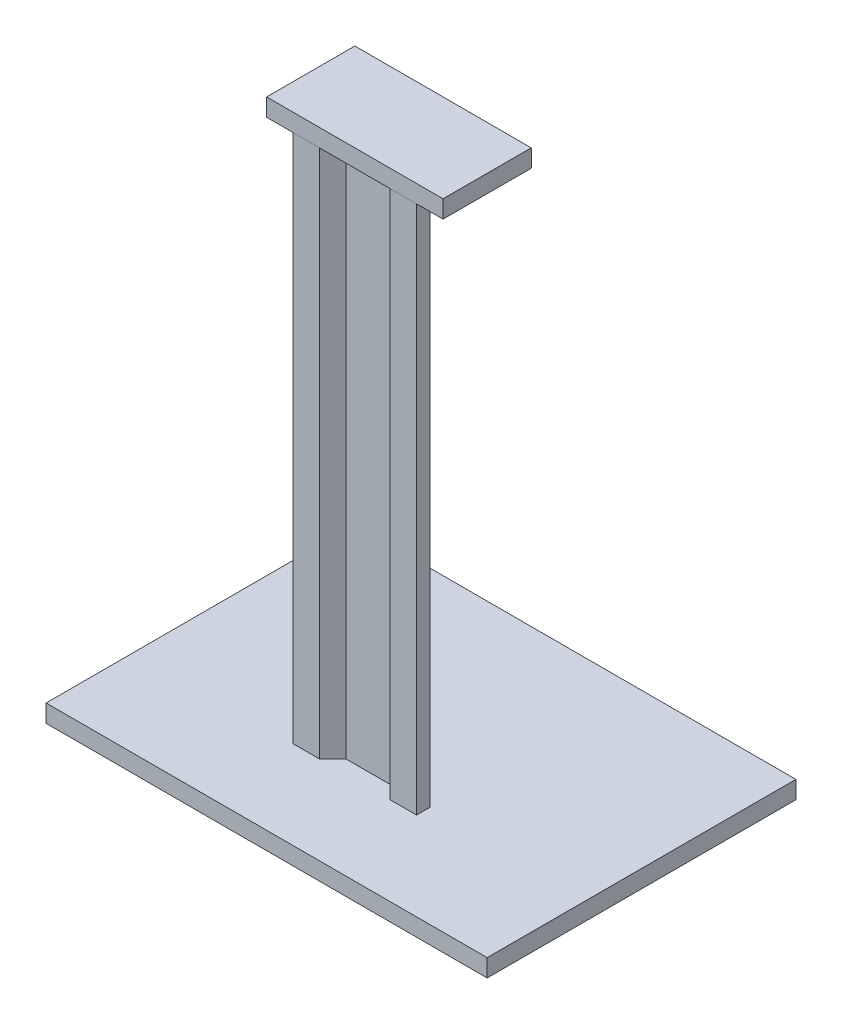
ISO-10303-21;
HEADER;
FILE_DESCRIPTION(('STEP AP214'),'2;1');
FILE_NAME('part.step','',(''),(''),'','','');
FILE_SCHEMA(('AUTOMOTIVE_DESIGN { 1 0 10303 214 1 1 1 1 }'));
ENDSEC;
DATA;
#1=APPLICATION_CONTEXT('core data for automotive mechanical design processes');
#2=APPLICATION_PROTOCOL_DEFINITION('international standard','automotive_design',2000,#1);
#3=PRODUCT_CONTEXT('',#1,'mechanical');
#4=PRODUCT('Part','Part','',(#3));
#5=PRODUCT_RELATED_PRODUCT_CATEGORY('part','',(#4));
#6=PRODUCT_DEFINITION_FORMATION('','',#4);
#7=PRODUCT_DEFINITION_CONTEXT('part definition',#1,'design');
#8=PRODUCT_DEFINITION('design','',#6,#7);
#9=PRODUCT_DEFINITION_SHAPE('','',#8);
#10=(LENGTH_UNIT() NAMED_UNIT(*) SI_UNIT(.MILLI.,.METRE.));
#11=(NAMED_UNIT(*) PLANE_ANGLE_UNIT() SI_UNIT($,.RADIAN.));
#12=(NAMED_UNIT(*) SI_UNIT($,.STERADIAN.) SOLID_ANGLE_UNIT());
#13=UNCERTAINTY_MEASURE_WITH_UNIT(LENGTH_MEASURE(1.E-05),#10,'distance_accuracy_value','');
#14=(GEOMETRIC_REPRESENTATION_CONTEXT(3) GLOBAL_UNCERTAINTY_ASSIGNED_CONTEXT((#13)) GLOBAL_UNIT_ASSIGNED_CONTEXT((#10,
#11,#12)) REPRESENTATION_CONTEXT('',''));
#15=CARTESIAN_POINT('',(0.,0.,0.));
#16=DIRECTION('',(0.,0.,1.));
#17=DIRECTION('',(1.,0.,0.));
#18=AXIS2_PLACEMENT_3D('',#15,#16,#17);
#19=CARTESIAN_POINT('',(-100.,620.,0.));
#20=DIRECTION('',(1.,0.,0.));
#21=DIRECTION('',(0.,0.,-1.));
#22=AXIS2_PLACEMENT_3D('',#19,#20,#21);
#23=PLANE('',#22);
#24=DIRECTION('',(0.,0.,1.));
#25=VECTOR('',#24,1.);
#26=CARTESIAN_POINT('',(-100.,600.,0.));
#27=LINE('',#26,#25);
#28=CARTESIAN_POINT('',(-100.,600.,-100.));
#29=VERTEX_POINT('',#28);
#30=CARTESIAN_POINT('',(-100.,600.,0.));
#31=VERTEX_POINT('',#30);
#32=EDGE_CURVE('E109',#29,#31,#27,.T.);
#33=ORIENTED_EDGE('',*,*,#32,.T.);
#34=DIRECTION('',(0.,-1.,0.));
#35=VECTOR('',#34,1.);
#36=CARTESIAN_POINT('',(-100.,620.,0.));
#37=LINE('',#36,#35);
#38=CARTESIAN_POINT('',(-100.,620.,0.));
#39=VERTEX_POINT('',#38);
#40=EDGE_CURVE('E12',#39,#31,#37,.T.);
#41=ORIENTED_EDGE('',*,*,#40,.F.);
#42=DIRECTION('',(0.,0.,1.));
#43=VECTOR('',#42,1.);
#44=CARTESIAN_POINT('',(-100.,620.,0.));
#45=LINE('',#44,#43);
#46=CARTESIAN_POINT('',(-100.,620.,-100.));
#47=VERTEX_POINT('',#46);
#48=EDGE_CURVE('E97',#47,#39,#45,.T.);
#49=ORIENTED_EDGE('',*,*,#48,.F.);
#50=DIRECTION('',(0.,-1.,0.));
#51=VECTOR('',#50,1.);
#52=CARTESIAN_POINT('',(-100.,620.,-100.));
#53=LINE('',#52,#51);
#54=EDGE_CURVE('E105',#47,#29,#53,.T.);
#55=ORIENTED_EDGE('',*,*,#54,.T.);
#56=EDGE_LOOP('',(#33,#41,#49,#55));
#57=FACE_BOUND('',#56,.T.);
#58=ADVANCED_FACE('F46',(#57),#23,.F.);
#59=CARTESIAN_POINT('',(-100.,620.,0.));
#60=DIRECTION('',(0.,0.,-1.));
#61=DIRECTION('',(-1.,0.,0.));
#62=AXIS2_PLACEMENT_3D('',#59,#60,#61);
#63=PLANE('',#62);
#64=DIRECTION('',(1.,0.,0.));
#65=VECTOR('',#64,1.);
#66=CARTESIAN_POINT('',(-100.,600.,0.));
#67=LINE('',#66,#65);
#68=CARTESIAN_POINT('',(100.,600.,0.));
#69=VERTEX_POINT('',#68);
#70=EDGE_CURVE('E101',#31,#69,#67,.T.);
#71=ORIENTED_EDGE('',*,*,#70,.T.);
#72=DIRECTION('',(0.,-1.,0.));
#73=VECTOR('',#72,1.);
#74=CARTESIAN_POINT('',(100.,620.,0.));
#75=LINE('',#74,#73);
#76=CARTESIAN_POINT('',(100.,620.,0.));
#77=VERTEX_POINT('',#76);
#78=EDGE_CURVE('E54',#77,#69,#75,.T.);
#79=ORIENTED_EDGE('',*,*,#78,.F.);
#80=DIRECTION('',(1.,0.,0.));
#81=VECTOR('',#80,1.);
#82=CARTESIAN_POINT('',(-100.,620.,0.));
#83=LINE('',#82,#81);
#84=EDGE_CURVE('E92',#39,#77,#83,.T.);
#85=ORIENTED_EDGE('',*,*,#84,.F.);
#86=ORIENTED_EDGE('',*,*,#40,.T.);
#87=EDGE_LOOP('',(#71,#79,#85,#86));
#88=FACE_BOUND('',#87,.T.);
#89=ADVANCED_FACE('F100',(#88),#63,.F.);
#90=CARTESIAN_POINT('',(100.,620.,0.));
#91=DIRECTION('',(-1.,0.,0.));
#92=DIRECTION('',(0.,0.,1.));
#93=AXIS2_PLACEMENT_3D('',#90,#91,#92);
#94=PLANE('',#93);
#95=DIRECTION('',(0.,0.,-1.));
#96=VECTOR('',#95,1.);
#97=CARTESIAN_POINT('',(100.,600.,0.));
#98=LINE('',#97,#96);
#99=CARTESIAN_POINT('',(100.,600.,-100.));
#100=VERTEX_POINT('',#99);
#101=EDGE_CURVE('E79',#69,#100,#98,.T.);
#102=ORIENTED_EDGE('',*,*,#101,.T.);
#103=DIRECTION('',(0.,-1.,0.));
#104=VECTOR('',#103,1.);
#105=CARTESIAN_POINT('',(100.,620.,-100.));
#106=LINE('',#105,#104);
#107=CARTESIAN_POINT('',(100.,620.,-100.));
#108=VERTEX_POINT('',#107);
#109=EDGE_CURVE('E102',#108,#100,#106,.T.);
#110=ORIENTED_EDGE('',*,*,#109,.F.);
#111=DIRECTION('',(0.,0.,-1.));
#112=VECTOR('',#111,1.);
#113=CARTESIAN_POINT('',(100.,620.,0.));
#114=LINE('',#113,#112);
#115=EDGE_CURVE('E95',#77,#108,#114,.T.);
#116=ORIENTED_EDGE('',*,*,#115,.F.);
#117=ORIENTED_EDGE('',*,*,#78,.T.);
#118=EDGE_LOOP('',(#102,#110,#116,#117));
#119=FACE_BOUND('',#118,.T.);
#120=ADVANCED_FACE('F103',(#119),#94,.F.);
#121=CARTESIAN_POINT('',(-100.,620.,-100.));
#122=DIRECTION('',(0.,0.,1.));
#123=DIRECTION('',(1.,0.,0.));
#124=AXIS2_PLACEMENT_3D('',#121,#122,#123);
#125=PLANE('',#124);
#126=DIRECTION('',(-1.,0.,0.));
#127=VECTOR('',#126,1.);
#128=CARTESIAN_POINT('',(-100.,600.,-100.));
#129=LINE('',#128,#127);
#130=EDGE_CURVE('E85',#100,#29,#129,.T.);
#131=ORIENTED_EDGE('',*,*,#130,.T.);
#132=ORIENTED_EDGE('',*,*,#54,.F.);
#133=DIRECTION('',(-1.,0.,0.));
#134=VECTOR('',#133,1.);
#135=CARTESIAN_POINT('',(-100.,620.,-100.));
#136=LINE('',#135,#134);
#137=EDGE_CURVE('E62',#108,#47,#136,.T.);
#138=ORIENTED_EDGE('',*,*,#137,.F.);
#139=ORIENTED_EDGE('',*,*,#109,.T.);
#140=EDGE_LOOP('',(#131,#132,#138,#139));
#141=FACE_BOUND('',#140,.T.);
#142=ADVANCED_FACE('F116',(#141),#125,.F.);
#143=CARTESIAN_POINT('',(0.,620.,0.));
#144=DIRECTION('',(0.,-1.,0.));
#145=DIRECTION('',(0.,0.,-1.));
#146=AXIS2_PLACEMENT_3D('',#143,#144,#145);
#147=PLANE('',#146);
#148=ORIENTED_EDGE('',*,*,#48,.T.);
#149=ORIENTED_EDGE('',*,*,#84,.T.);
#150=ORIENTED_EDGE('',*,*,#115,.T.);
#151=ORIENTED_EDGE('',*,*,#137,.T.);
#152=EDGE_LOOP('',(#148,#149,#150,#151));
#153=FACE_BOUND('',#152,.T.);
#154=ADVANCED_FACE('F93',(#153),#147,.F.);
#155=CARTESIAN_POINT('',(0.,600.,0.));
#156=DIRECTION('',(0.,-1.,0.));
#157=DIRECTION('',(0.,0.,-1.));
#158=AXIS2_PLACEMENT_3D('',#155,#156,#157);
#159=PLANE('',#158);
#160=ORIENTED_EDGE('',*,*,#32,.F.);
#161=ORIENTED_EDGE('',*,*,#130,.F.);
#162=ORIENTED_EDGE('',*,*,#101,.F.);
#163=ORIENTED_EDGE('',*,*,#70,.F.);
#164=EDGE_LOOP('',(#160,#161,#162,#163));
#165=FACE_BOUND('',#164,.T.);
#166=ADVANCED_FACE('F119',(#165),#159,.T.);
#167=CLOSED_SHELL('',(#58,#89,#120,#142,#154,#166));
#168=MANIFOLD_SOLID_BREP('B2',#167);
#169=CARTESIAN_POINT('',(0.,0.,0.));
#170=DIRECTION('',(0.,1.,0.));
#171=DIRECTION('',(0.,0.,1.));
#172=AXIS2_PLACEMENT_3D('',#169,#170,#171);
#173=PLANE('',#172);
#174=CARTESIAN_POINT('',(0.,0.,-61.2132034355965));
#175=DIRECTION('',(0.,1.,0.));
#176=DIRECTION('',(0.,0.,1.));
#177=AXIS2_PLACEMENT_3D('',#174,#175,#176);
#178=CIRCLE('',#177,15.);
#179=CARTESIAN_POINT('',(0.,0.,-46.2132034355965));
#180=VERTEX_POINT('',#179);
#181=EDGE_CURVE('E194',#180,#180,#178,.F.);
#182=ORIENTED_EDGE('',*,*,#181,.T.);
#183=EDGE_LOOP('',(#182));
#184=FACE_BOUND('',#183,.T.);
#185=ADVANCED_FACE('F190',(#184),#173,.F.);
#186=CARTESIAN_POINT('',(0.,-20.002,-61.2132034355965));
#187=DIRECTION('',(0.,1.,0.));
#188=DIRECTION('',(0.,0.,1.));
#189=AXIS2_PLACEMENT_3D('',#186,#187,#188);
#190=CYLINDRICAL_SURFACE('',#189,15.);
#191=ORIENTED_EDGE('',*,*,#181,.F.);
#192=EDGE_LOOP('',(#191));
#193=FACE_BOUND('',#192,.T.);
#194=CARTESIAN_POINT('',(0.,600.,-61.2132034355965));
#195=DIRECTION('',(0.,1.,0.));
#196=DIRECTION('',(0.,0.,1.));
#197=AXIS2_PLACEMENT_3D('',#194,#195,#196);
#198=CIRCLE('',#197,15.);
#199=CARTESIAN_POINT('',(0.,600.,-46.2132034355965));
#200=VERTEX_POINT('',#199);
#201=EDGE_CURVE('E45',#200,#200,#198,.T.);
#202=ORIENTED_EDGE('',*,*,#201,.F.);
#203=EDGE_LOOP('',(#202));
#204=FACE_BOUND('',#203,.T.);
#205=ADVANCED_FACE('F192',(#193,#204),#190,.T.);
#206=CARTESIAN_POINT('',(0.,600.,-61.2132034355965));
#207=DIRECTION('',(0.,1.,0.));
#208=DIRECTION('',(0.,0.,1.));
#209=AXIS2_PLACEMENT_3D('',#206,#207,#208);
#210=PLANE('',#209);
#211=ORIENTED_EDGE('',*,*,#201,.T.);
#212=EDGE_LOOP('',(#211));
#213=FACE_BOUND('',#212,.T.);
#214=ADVANCED_FACE('F206',(#213),#210,.T.);
#215=CLOSED_SHELL('',(#185,#205,#214));
#216=MANIFOLD_SOLID_BREP('B6',#215);
#217=CARTESIAN_POINT('',(70.,600.,-15.));
#218=DIRECTION('',(0.,0.,1.));
#219=DIRECTION('',(1.,0.,0.));
#220=AXIS2_PLACEMENT_3D('',#217,#218,#219);
#221=PLANE('',#220);
#222=DIRECTION('',(0.,1.,0.));
#223=VECTOR('',#222,1.);
#224=CARTESIAN_POINT('',(59.6066017177983,0.,-15.));
#225=LINE('',#224,#223);
#226=CARTESIAN_POINT('',(59.6066017177983,0.,-15.));
#227=VERTEX_POINT('',#226);
#228=CARTESIAN_POINT('',(59.6066017177982,600.,-15.));
#229=VERTEX_POINT('',#228);
#230=EDGE_CURVE('E251',#227,#229,#225,.T.);
#231=ORIENTED_EDGE('',*,*,#230,.T.);
#232=DIRECTION('',(-1.,0.,0.));
#233=VECTOR('',#232,1.);
#234=CARTESIAN_POINT('',(70.,600.,-15.));
#235=LINE('',#234,#233);
#236=CARTESIAN_POINT('',(70.,600.,-15.));
#237=VERTEX_POINT('',#236);
#238=EDGE_CURVE('E499',#237,#229,#235,.T.);
#239=ORIENTED_EDGE('',*,*,#238,.F.);
#240=DIRECTION('',(0.,-1.,0.));
#241=VECTOR('',#240,1.);
#242=CARTESIAN_POINT('',(70.,600.,-15.));
#243=LINE('',#242,#241);
#244=CARTESIAN_POINT('',(70.,0.,-15.));
#245=VERTEX_POINT('',#244);
#246=EDGE_CURVE('E244',#237,#245,#243,.T.);
#247=ORIENTED_EDGE('',*,*,#246,.T.);
#248=DIRECTION('',(-1.,0.,0.));
#249=VECTOR('',#248,1.);
#250=CARTESIAN_POINT('',(70.,0.,-15.));
#251=LINE('',#250,#249);
#252=EDGE_CURVE('E531',#245,#227,#251,.T.);
#253=ORIENTED_EDGE('',*,*,#252,.T.);
#254=EDGE_LOOP('',(#231,#239,#247,#253));
#255=FACE_BOUND('',#254,.T.);
#256=ADVANCED_FACE('F236',(#255),#221,.F.);
#257=DIRECTION('',(0.,-1.,0.));
#258=VECTOR('',#257,1.);
#259=CARTESIAN_POINT('',(56.6066017177983,0.,-15.));
#260=LINE('',#259,#258);
#261=CARTESIAN_POINT('',(56.6066017177982,600.,-15.));
#262=VERTEX_POINT('',#261);
#263=CARTESIAN_POINT('',(56.6066017177983,0.,-15.));
#264=VERTEX_POINT('',#263);
#265=EDGE_CURVE('E423',#262,#264,#260,.T.);
#266=ORIENTED_EDGE('',*,*,#265,.T.);
#267=CARTESIAN_POINT('',(46.2132034355965,0.,-15.));
#268=VERTEX_POINT('',#267);
#269=EDGE_CURVE('E530',#264,#268,#251,.T.);
#270=ORIENTED_EDGE('',*,*,#269,.T.);
#271=DIRECTION('',(0.,-1.,0.));
#272=VECTOR('',#271,1.);
#273=CARTESIAN_POINT('',(46.2132034355965,600.,-15.));
#274=LINE('',#273,#272);
#275=CARTESIAN_POINT('',(46.2132034355965,600.,-15.));
#276=VERTEX_POINT('',#275);
#277=EDGE_CURVE('E592',#276,#268,#274,.T.);
#278=ORIENTED_EDGE('',*,*,#277,.F.);
#279=EDGE_CURVE('E498',#262,#276,#235,.T.);
#280=ORIENTED_EDGE('',*,*,#279,.F.);
#281=EDGE_LOOP('',(#266,#270,#278,#280));
#282=FACE_BOUND('',#281,.T.);
#283=ADVANCED_FACE('F664',(#282),#221,.F.);
#284=CARTESIAN_POINT('',(0.,600.,0.));
#285=DIRECTION('',(0.,1.,0.));
#286=DIRECTION('',(0.,0.,1.));
#287=AXIS2_PLACEMENT_3D('',#284,#285,#286);
#288=PLANE('',#287);
#289=ORIENTED_EDGE('',*,*,#238,.T.);
#290=DIRECTION('',(0.,0.,-1.));
#291=VECTOR('',#290,1.);
#292=CARTESIAN_POINT('',(59.6066017177982,600.,-13.));
#293=LINE('',#292,#291);
#294=CARTESIAN_POINT('',(59.6066017177982,600.,-13.));
#295=VERTEX_POINT('',#294);
#296=EDGE_CURVE('E431',#295,#229,#293,.T.);
#297=ORIENTED_EDGE('',*,*,#296,.F.);
#298=DIRECTION('',(-1.,0.,0.));
#299=VECTOR('',#298,1.);
#300=CARTESIAN_POINT('',(56.6066017177982,600.,-13.));
#301=LINE('',#300,#299);
#302=CARTESIAN_POINT('',(56.6066017177982,600.,-13.));
#303=VERTEX_POINT('',#302);
#304=EDGE_CURVE('E419',#295,#303,#301,.T.);
#305=ORIENTED_EDGE('',*,*,#304,.T.);
#306=DIRECTION('',(0.,0.,-1.));
#307=VECTOR('',#306,1.);
#308=CARTESIAN_POINT('',(56.6066017177982,600.,-13.));
#309=LINE('',#308,#307);
#310=EDGE_CURVE('E434',#303,#262,#309,.T.);
#311=ORIENTED_EDGE('',*,*,#310,.T.);
#312=ORIENTED_EDGE('',*,*,#279,.T.);
#313=DIRECTION('',(-0.707106781186546,0.,-0.707106781186549));
#314=VECTOR('',#313,1.);
#315=CARTESIAN_POINT('',(46.2132034355965,600.,-15.));
#316=LINE('',#315,#314);
#317=CARTESIAN_POINT('',(10.6066017177983,600.,-50.6066017177984));
#318=VERTEX_POINT('',#317);
#319=EDGE_CURVE('E502',#276,#318,#316,.T.);
#320=ORIENTED_EDGE('',*,*,#319,.T.);
#321=DIRECTION('',(-0.707106781186543,0.,0.707106781186552));
#322=VECTOR('',#321,1.);
#323=CARTESIAN_POINT('',(10.6066017177983,600.,-50.6066017177984));
#324=LINE('',#323,#322);
#325=CARTESIAN_POINT('',(0.,600.,-40.));
#326=VERTEX_POINT('',#325);
#327=EDGE_CURVE('E504',#318,#326,#324,.T.);
#328=ORIENTED_EDGE('',*,*,#327,.T.);
#329=DIRECTION('',(-0.707106781186543,0.,-0.707106781186552));
#330=VECTOR('',#329,1.);
#331=CARTESIAN_POINT('',(-10.6066017177983,600.,-50.6066017177984));
#332=LINE('',#331,#330);
#333=CARTESIAN_POINT('',(-10.6066017177983,600.,-50.6066017177984));
#334=VERTEX_POINT('',#333);
#335=EDGE_CURVE('E506',#326,#334,#332,.T.);
#336=ORIENTED_EDGE('',*,*,#335,.T.);
#337=DIRECTION('',(-0.707106781186546,0.,0.707106781186549));
#338=VECTOR('',#337,1.);
#339=CARTESIAN_POINT('',(-46.2132034355965,600.,-15.));
#340=LINE('',#339,#338);
#341=CARTESIAN_POINT('',(-46.2132034355965,600.,-15.));
#342=VERTEX_POINT('',#341);
#343=EDGE_CURVE('E508',#334,#342,#340,.T.);
#344=ORIENTED_EDGE('',*,*,#343,.T.);
#345=DIRECTION('',(-1.,0.,0.));
#346=VECTOR('',#345,1.);
#347=CARTESIAN_POINT('',(-70.,600.,-15.));
#348=LINE('',#347,#346);
#349=CARTESIAN_POINT('',(-56.6066017177982,600.,-15.));
#350=VERTEX_POINT('',#349);
#351=EDGE_CURVE('E511',#342,#350,#348,.T.);
#352=ORIENTED_EDGE('',*,*,#351,.T.);
#353=DIRECTION('',(0.,0.,-1.));
#354=VECTOR('',#353,1.);
#355=CARTESIAN_POINT('',(-56.6066017177982,600.,-13.));
#356=LINE('',#355,#354);
#357=CARTESIAN_POINT('',(-56.6066017177982,600.,-13.));
#358=VERTEX_POINT('',#357);
#359=EDGE_CURVE('E458',#358,#350,#356,.T.);
#360=ORIENTED_EDGE('',*,*,#359,.F.);
#361=DIRECTION('',(1.,0.,0.));
#362=VECTOR('',#361,1.);
#363=CARTESIAN_POINT('',(-56.6066017177982,600.,-13.));
#364=LINE('',#363,#362);
#365=CARTESIAN_POINT('',(-59.6066017177982,600.,-13.));
#366=VERTEX_POINT('',#365);
#367=EDGE_CURVE('E441',#366,#358,#364,.T.);
#368=ORIENTED_EDGE('',*,*,#367,.F.);
#369=DIRECTION('',(0.,0.,-1.));
#370=VECTOR('',#369,1.);
#371=CARTESIAN_POINT('',(-59.6066017177982,600.,-13.));
#372=LINE('',#371,#370);
#373=CARTESIAN_POINT('',(-59.6066017177982,600.,-15.));
#374=VERTEX_POINT('',#373);
#375=EDGE_CURVE('E450',#366,#374,#372,.T.);
#376=ORIENTED_EDGE('',*,*,#375,.T.);
#377=CARTESIAN_POINT('',(-70.,600.,-15.));
#378=VERTEX_POINT('',#377);
#379=EDGE_CURVE('E510',#374,#378,#348,.T.);
#380=ORIENTED_EDGE('',*,*,#379,.T.);
#381=DIRECTION('',(0.,0.,1.));
#382=VECTOR('',#381,1.);
#383=CARTESIAN_POINT('',(-70.,600.,0.));
#384=LINE('',#383,#382);
#385=CARTESIAN_POINT('',(-70.,600.,0.));
#386=VERTEX_POINT('',#385);
#387=EDGE_CURVE('E514',#378,#386,#384,.T.);
#388=ORIENTED_EDGE('',*,*,#387,.T.);
#389=DIRECTION('',(1.,0.,0.));
#390=VECTOR('',#389,1.);
#391=CARTESIAN_POINT('',(-39.9999999999999,600.,0.));
#392=LINE('',#391,#390);
#393=CARTESIAN_POINT('',(-39.9999999999999,600.,0.));
#394=VERTEX_POINT('',#393);
#395=EDGE_CURVE('E516',#386,#394,#392,.T.);
#396=ORIENTED_EDGE('',*,*,#395,.T.);
#397=DIRECTION('',(0.707106781186546,0.,-0.707106781186549));
#398=VECTOR('',#397,1.);
#399=CARTESIAN_POINT('',(-25.,600.,-15.));
#400=LINE('',#399,#398);
#401=CARTESIAN_POINT('',(-25.,600.,-15.));
#402=VERTEX_POINT('',#401);
#403=EDGE_CURVE('E518',#394,#402,#400,.T.);
#404=ORIENTED_EDGE('',*,*,#403,.T.);
#405=DIRECTION('',(1.,0.,0.));
#406=VECTOR('',#405,1.);
#407=CARTESIAN_POINT('',(25.,600.,-15.));
#408=LINE('',#407,#406);
#409=CARTESIAN_POINT('',(25.,600.,-15.));
#410=VERTEX_POINT('',#409);
#411=EDGE_CURVE('E520',#402,#410,#408,.T.);
#412=ORIENTED_EDGE('',*,*,#411,.T.);
#413=DIRECTION('',(0.707106781186546,0.,0.707106781186549));
#414=VECTOR('',#413,1.);
#415=CARTESIAN_POINT('',(25.,600.,-15.));
#416=LINE('',#415,#414);
#417=CARTESIAN_POINT('',(39.9999999999999,600.,0.));
#418=VERTEX_POINT('',#417);
#419=EDGE_CURVE('E522',#410,#418,#416,.T.);
#420=ORIENTED_EDGE('',*,*,#419,.T.);
#421=DIRECTION('',(1.,0.,0.));
#422=VECTOR('',#421,1.);
#423=CARTESIAN_POINT('',(39.9999999999999,600.,0.));
#424=LINE('',#423,#422);
#425=CARTESIAN_POINT('',(70.,600.,0.));
#426=VERTEX_POINT('',#425);
#427=EDGE_CURVE('E492',#418,#426,#424,.T.);
#428=ORIENTED_EDGE('',*,*,#427,.T.);
#429=DIRECTION('',(0.,0.,-1.));
#430=VECTOR('',#429,1.);
#431=CARTESIAN_POINT('',(70.,600.,0.));
#432=LINE('',#431,#430);
#433=EDGE_CURVE('E495',#426,#237,#432,.T.);
#434=ORIENTED_EDGE('',*,*,#433,.T.);
#435=EDGE_LOOP('',(#289,#297,#305,#311,#312,#320,#328,#336,#344,#352,#360,#368,#376,#380,#388,
#396,#404,#412,#420,#428,#434));
#436=FACE_BOUND('',#435,.T.);
#437=ADVANCED_FACE('F609',(#436),#288,.T.);
#438=CARTESIAN_POINT('',(-70.,600.,-15.));
#439=DIRECTION('',(0.,0.,1.));
#440=DIRECTION('',(1.,0.,0.));
#441=AXIS2_PLACEMENT_3D('',#438,#439,#440);
#442=PLANE('',#441);
#443=ORIENTED_EDGE('',*,*,#379,.F.);
#444=DIRECTION('',(0.,1.,0.));
#445=VECTOR('',#444,1.);
#446=CARTESIAN_POINT('',(-59.6066017177983,0.,-15.));
#447=LINE('',#446,#445);
#448=CARTESIAN_POINT('',(-59.6066017177983,0.,-15.));
#449=VERTEX_POINT('',#448);
#450=EDGE_CURVE('E433',#449,#374,#447,.T.);
#451=ORIENTED_EDGE('',*,*,#450,.F.);
#452=DIRECTION('',(-1.,0.,0.));
#453=VECTOR('',#452,1.);
#454=CARTESIAN_POINT('',(-70.,0.,-15.));
#455=LINE('',#454,#453);
#456=CARTESIAN_POINT('',(-70.,0.,-15.));
#457=VERTEX_POINT('',#456);
#458=EDGE_CURVE('E545',#449,#457,#455,.T.);
#459=ORIENTED_EDGE('',*,*,#458,.T.);
#460=DIRECTION('',(0.,-1.,0.));
#461=VECTOR('',#460,1.);
#462=CARTESIAN_POINT('',(-70.,600.,-15.));
#463=LINE('',#462,#461);
#464=EDGE_CURVE('E577',#378,#457,#463,.T.);
#465=ORIENTED_EDGE('',*,*,#464,.F.);
#466=EDGE_LOOP('',(#443,#451,#459,#465));
#467=FACE_BOUND('',#466,.T.);
#468=ADVANCED_FACE('F630',(#467),#442,.F.);
#469=CARTESIAN_POINT('',(39.9999999999999,600.,0.));
#470=DIRECTION('',(0.,0.,-1.));
#471=DIRECTION('',(-1.,0.,0.));
#472=AXIS2_PLACEMENT_3D('',#469,#470,#471);
#473=PLANE('',#472);
#474=DIRECTION('',(1.,0.,0.));
#475=VECTOR('',#474,1.);
#476=CARTESIAN_POINT('',(39.9999999999999,0.,0.));
#477=LINE('',#476,#475);
#478=CARTESIAN_POINT('',(39.9999999999999,0.,0.));
#479=VERTEX_POINT('',#478);
#480=CARTESIAN_POINT('',(70.,0.,0.));
#481=VERTEX_POINT('',#480);
#482=EDGE_CURVE('E491',#479,#481,#477,.T.);
#483=ORIENTED_EDGE('',*,*,#482,.T.);
#484=DIRECTION('',(0.,-1.,0.));
#485=VECTOR('',#484,1.);
#486=CARTESIAN_POINT('',(70.,600.,0.));
#487=LINE('',#486,#485);
#488=EDGE_CURVE('E188',#426,#481,#487,.T.);
#489=ORIENTED_EDGE('',*,*,#488,.F.);
#490=ORIENTED_EDGE('',*,*,#427,.F.);
#491=DIRECTION('',(0.,-1.,0.));
#492=VECTOR('',#491,1.);
#493=CARTESIAN_POINT('',(39.9999999999999,600.,0.));
#494=LINE('',#493,#492);
#495=EDGE_CURVE('E524',#418,#479,#494,.T.);
#496=ORIENTED_EDGE('',*,*,#495,.T.);
#497=EDGE_LOOP('',(#483,#489,#490,#496));
#498=FACE_BOUND('',#497,.T.);
#499=ADVANCED_FACE('F238',(#498),#473,.F.);
#500=CARTESIAN_POINT('',(70.,600.,0.));
#501=DIRECTION('',(-1.,0.,0.));
#502=DIRECTION('',(0.,0.,1.));
#503=AXIS2_PLACEMENT_3D('',#500,#501,#502);
#504=PLANE('',#503);
#505=DIRECTION('',(0.,0.,-1.));
#506=VECTOR('',#505,1.);
#507=CARTESIAN_POINT('',(70.,0.,0.));
#508=LINE('',#507,#506);
#509=EDGE_CURVE('E527',#481,#245,#508,.T.);
#510=ORIENTED_EDGE('',*,*,#509,.T.);
#511=ORIENTED_EDGE('',*,*,#246,.F.);
#512=ORIENTED_EDGE('',*,*,#433,.F.);
#513=ORIENTED_EDGE('',*,*,#488,.T.);
#514=EDGE_LOOP('',(#510,#511,#512,#513));
#515=FACE_BOUND('',#514,.T.);
#516=ADVANCED_FACE('F599',(#515),#504,.F.);
#517=CARTESIAN_POINT('',(46.2132034355965,600.,-15.));
#518=DIRECTION('',(-0.707106781186549,0.,0.707106781186546));
#519=DIRECTION('',(0.707106781186546,0.,0.707106781186549));
#520=AXIS2_PLACEMENT_3D('',#517,#518,#519);
#521=PLANE('',#520);
#522=DIRECTION('',(-0.707106781186546,0.,-0.707106781186549));
#523=VECTOR('',#522,1.);
#524=CARTESIAN_POINT('',(46.2132034355965,0.,-15.));
#525=LINE('',#524,#523);
#526=CARTESIAN_POINT('',(10.6066017177983,0.,-50.6066017177984));
#527=VERTEX_POINT('',#526);
#528=EDGE_CURVE('E533',#268,#527,#525,.T.);
#529=ORIENTED_EDGE('',*,*,#528,.T.);
#530=DIRECTION('',(0.,-1.,0.));
#531=VECTOR('',#530,1.);
#532=CARTESIAN_POINT('',(10.6066017177983,600.,-50.6066017177984));
#533=LINE('',#532,#531);
#534=EDGE_CURVE('E589',#318,#527,#533,.T.);
#535=ORIENTED_EDGE('',*,*,#534,.F.);
#536=ORIENTED_EDGE('',*,*,#319,.F.);
#537=ORIENTED_EDGE('',*,*,#277,.T.);
#538=EDGE_LOOP('',(#529,#535,#536,#537));
#539=FACE_BOUND('',#538,.T.);
#540=ADVANCED_FACE('F659',(#539),#521,.F.);
#541=CARTESIAN_POINT('',(10.6066017177983,600.,-50.6066017177984));
#542=DIRECTION('',(0.707106781186552,0.,0.707106781186543));
#543=DIRECTION('',(0.707106781186543,0.,-0.707106781186552));
#544=AXIS2_PLACEMENT_3D('',#541,#542,#543);
#545=PLANE('',#544);
#546=DIRECTION('',(-0.707106781186543,0.,0.707106781186552));
#547=VECTOR('',#546,1.);
#548=CARTESIAN_POINT('',(10.6066017177983,0.,-50.6066017177984));
#549=LINE('',#548,#547);
#550=CARTESIAN_POINT('',(0.,0.,-40.));
#551=VERTEX_POINT('',#550);
#552=EDGE_CURVE('E536',#527,#551,#549,.T.);
#553=ORIENTED_EDGE('',*,*,#552,.T.);
#554=DIRECTION('',(0.,-1.,0.));
#555=VECTOR('',#554,1.);
#556=CARTESIAN_POINT('',(0.,600.,-40.));
#557=LINE('',#556,#555);
#558=EDGE_CURVE('E586',#326,#551,#557,.T.);
#559=ORIENTED_EDGE('',*,*,#558,.F.);
#560=ORIENTED_EDGE('',*,*,#327,.F.);
#561=ORIENTED_EDGE('',*,*,#534,.T.);
#562=EDGE_LOOP('',(#553,#559,#560,#561));
#563=FACE_BOUND('',#562,.T.);
#564=ADVANCED_FACE('F655',(#563),#545,.F.);
#565=CARTESIAN_POINT('',(-10.6066017177983,600.,-50.6066017177984));
#566=DIRECTION('',(-0.707106781186552,0.,0.707106781186543));
#567=DIRECTION('',(0.707106781186543,0.,0.707106781186552));
#568=AXIS2_PLACEMENT_3D('',#565,#566,#567);
#569=PLANE('',#568);
#570=DIRECTION('',(-0.707106781186543,0.,-0.707106781186552));
#571=VECTOR('',#570,1.);
#572=CARTESIAN_POINT('',(-10.6066017177983,0.,-50.6066017177984));
#573=LINE('',#572,#571);
#574=CARTESIAN_POINT('',(-10.6066017177983,0.,-50.6066017177984));
#575=VERTEX_POINT('',#574);
#576=EDGE_CURVE('E539',#551,#575,#573,.T.);
#577=ORIENTED_EDGE('',*,*,#576,.T.);
#578=DIRECTION('',(0.,-1.,0.));
#579=VECTOR('',#578,1.);
#580=CARTESIAN_POINT('',(-10.6066017177983,600.,-50.6066017177984));
#581=LINE('',#580,#579);
#582=EDGE_CURVE('E583',#334,#575,#581,.T.);
#583=ORIENTED_EDGE('',*,*,#582,.F.);
#584=ORIENTED_EDGE('',*,*,#335,.F.);
#585=ORIENTED_EDGE('',*,*,#558,.T.);
#586=EDGE_LOOP('',(#577,#583,#584,#585));
#587=FACE_BOUND('',#586,.T.);
#588=ADVANCED_FACE('F650',(#587),#569,.F.);
#589=CARTESIAN_POINT('',(-46.2132034355965,600.,-15.));
#590=DIRECTION('',(0.707106781186549,0.,0.707106781186546));
#591=DIRECTION('',(0.707106781186546,0.,-0.707106781186549));
#592=AXIS2_PLACEMENT_3D('',#589,#590,#591);
#593=PLANE('',#592);
#594=DIRECTION('',(-0.707106781186546,0.,0.707106781186549));
#595=VECTOR('',#594,1.);
#596=CARTESIAN_POINT('',(-46.2132034355965,0.,-15.));
#597=LINE('',#596,#595);
#598=CARTESIAN_POINT('',(-46.2132034355965,0.,-15.));
#599=VERTEX_POINT('',#598);
#600=EDGE_CURVE('E542',#575,#599,#597,.T.);
#601=ORIENTED_EDGE('',*,*,#600,.T.);
#602=DIRECTION('',(0.,-1.,0.));
#603=VECTOR('',#602,1.);
#604=CARTESIAN_POINT('',(-46.2132034355965,600.,-15.));
#605=LINE('',#604,#603);
#606=EDGE_CURVE('E580',#342,#599,#605,.T.);
#607=ORIENTED_EDGE('',*,*,#606,.F.);
#608=ORIENTED_EDGE('',*,*,#343,.F.);
#609=ORIENTED_EDGE('',*,*,#582,.T.);
#610=EDGE_LOOP('',(#601,#607,#608,#609));
#611=FACE_BOUND('',#610,.T.);
#612=ADVANCED_FACE('F647',(#611),#593,.F.);
#613=CARTESIAN_POINT('',(-56.6066017177982,0.,-15.));
#614=VERTEX_POINT('',#613);
#615=EDGE_CURVE('E546',#599,#614,#455,.T.);
#616=ORIENTED_EDGE('',*,*,#615,.T.);
#617=DIRECTION('',(0.,-1.,0.));
#618=VECTOR('',#617,1.);
#619=CARTESIAN_POINT('',(-56.6066017177983,0.,-15.));
#620=LINE('',#619,#618);
#621=EDGE_CURVE('E259',#350,#614,#620,.T.);
#622=ORIENTED_EDGE('',*,*,#621,.F.);
#623=ORIENTED_EDGE('',*,*,#351,.F.);
#624=ORIENTED_EDGE('',*,*,#606,.T.);
#625=EDGE_LOOP('',(#616,#622,#623,#624));
#626=FACE_BOUND('',#625,.T.);
#627=ADVANCED_FACE('F642',(#626),#442,.F.);
#628=CARTESIAN_POINT('',(-70.,600.,0.));
#629=DIRECTION('',(1.,0.,0.));
#630=DIRECTION('',(0.,0.,-1.));
#631=AXIS2_PLACEMENT_3D('',#628,#629,#630);
#632=PLANE('',#631);
#633=DIRECTION('',(0.,0.,1.));
#634=VECTOR('',#633,1.);
#635=CARTESIAN_POINT('',(-70.,0.,0.));
#636=LINE('',#635,#634);
#637=CARTESIAN_POINT('',(-70.,0.,0.));
#638=VERTEX_POINT('',#637);
#639=EDGE_CURVE('E549',#457,#638,#636,.T.);
#640=ORIENTED_EDGE('',*,*,#639,.T.);
#641=DIRECTION('',(0.,-1.,0.));
#642=VECTOR('',#641,1.);
#643=CARTESIAN_POINT('',(-70.,600.,0.));
#644=LINE('',#643,#642);
#645=EDGE_CURVE('E574',#386,#638,#644,.T.);
#646=ORIENTED_EDGE('',*,*,#645,.F.);
#647=ORIENTED_EDGE('',*,*,#387,.F.);
#648=ORIENTED_EDGE('',*,*,#464,.T.);
#649=EDGE_LOOP('',(#640,#646,#647,#648));
#650=FACE_BOUND('',#649,.T.);
#651=ADVANCED_FACE('F625',(#650),#632,.F.);
#652=CARTESIAN_POINT('',(-39.9999999999999,600.,0.));
#653=DIRECTION('',(0.,0.,-1.));
#654=DIRECTION('',(-1.,0.,0.));
#655=AXIS2_PLACEMENT_3D('',#652,#653,#654);
#656=PLANE('',#655);
#657=DIRECTION('',(1.,0.,0.));
#658=VECTOR('',#657,1.);
#659=CARTESIAN_POINT('',(-39.9999999999999,0.,0.));
#660=LINE('',#659,#658);
#661=CARTESIAN_POINT('',(-39.9999999999999,0.,0.));
#662=VERTEX_POINT('',#661);
#663=EDGE_CURVE('E552',#638,#662,#660,.T.);
#664=ORIENTED_EDGE('',*,*,#663,.T.);
#665=DIRECTION('',(0.,-1.,0.));
#666=VECTOR('',#665,1.);
#667=CARTESIAN_POINT('',(-39.9999999999999,600.,0.));
#668=LINE('',#667,#666);
#669=EDGE_CURVE('E571',#394,#662,#668,.T.);
#670=ORIENTED_EDGE('',*,*,#669,.F.);
#671=ORIENTED_EDGE('',*,*,#395,.F.);
#672=ORIENTED_EDGE('',*,*,#645,.T.);
#673=EDGE_LOOP('',(#664,#670,#671,#672));
#674=FACE_BOUND('',#673,.T.);
#675=ADVANCED_FACE('F620',(#674),#656,.F.);
#676=CARTESIAN_POINT('',(-25.,600.,-15.));
#677=DIRECTION('',(-0.707106781186549,0.,-0.707106781186546));
#678=DIRECTION('',(-0.707106781186546,0.,0.707106781186549));
#679=AXIS2_PLACEMENT_3D('',#676,#677,#678);
#680=PLANE('',#679);
#681=DIRECTION('',(0.707106781186546,0.,-0.707106781186549));
#682=VECTOR('',#681,1.);
#683=CARTESIAN_POINT('',(-25.,0.,-15.));
#684=LINE('',#683,#682);
#685=CARTESIAN_POINT('',(-25.,0.,-15.));
#686=VERTEX_POINT('',#685);
#687=EDGE_CURVE('E555',#662,#686,#684,.T.);
#688=ORIENTED_EDGE('',*,*,#687,.T.);
#689=DIRECTION('',(0.,-1.,0.));
#690=VECTOR('',#689,1.);
#691=CARTESIAN_POINT('',(-25.,600.,-15.));
#692=LINE('',#691,#690);
#693=EDGE_CURVE('E568',#402,#686,#692,.T.);
#694=ORIENTED_EDGE('',*,*,#693,.F.);
#695=ORIENTED_EDGE('',*,*,#403,.F.);
#696=ORIENTED_EDGE('',*,*,#669,.T.);
#697=EDGE_LOOP('',(#688,#694,#695,#696));
#698=FACE_BOUND('',#697,.T.);
#699=ADVANCED_FACE('F616',(#698),#680,.F.);
#700=CARTESIAN_POINT('',(25.,600.,-15.));
#701=DIRECTION('',(0.,0.,-1.));
#702=DIRECTION('',(-1.,0.,0.));
#703=AXIS2_PLACEMENT_3D('',#700,#701,#702);
#704=PLANE('',#703);
#705=DIRECTION('',(1.,0.,0.));
#706=VECTOR('',#705,1.);
#707=CARTESIAN_POINT('',(25.,0.,-15.));
#708=LINE('',#707,#706);
#709=CARTESIAN_POINT('',(25.,0.,-15.));
#710=VERTEX_POINT('',#709);
#711=EDGE_CURVE('E558',#686,#710,#708,.T.);
#712=ORIENTED_EDGE('',*,*,#711,.T.);
#713=DIRECTION('',(0.,-1.,0.));
#714=VECTOR('',#713,1.);
#715=CARTESIAN_POINT('',(25.,600.,-15.));
#716=LINE('',#715,#714);
#717=EDGE_CURVE('E565',#410,#710,#716,.T.);
#718=ORIENTED_EDGE('',*,*,#717,.F.);
#719=ORIENTED_EDGE('',*,*,#411,.F.);
#720=ORIENTED_EDGE('',*,*,#693,.T.);
#721=EDGE_LOOP('',(#712,#718,#719,#720));
#722=FACE_BOUND('',#721,.T.);
#723=ADVANCED_FACE('F614',(#722),#704,.F.);
#724=CARTESIAN_POINT('',(25.,600.,-15.));
#725=DIRECTION('',(0.707106781186549,0.,-0.707106781186546));
#726=DIRECTION('',(-0.707106781186546,0.,-0.707106781186549));
#727=AXIS2_PLACEMENT_3D('',#724,#725,#726);
#728=PLANE('',#727);
#729=DIRECTION('',(0.707106781186546,0.,0.707106781186549));
#730=VECTOR('',#729,1.);
#731=CARTESIAN_POINT('',(25.,0.,-15.));
#732=LINE('',#731,#730);
#733=EDGE_CURVE('E496',#710,#479,#732,.T.);
#734=ORIENTED_EDGE('',*,*,#733,.T.);
#735=ORIENTED_EDGE('',*,*,#495,.F.);
#736=ORIENTED_EDGE('',*,*,#419,.F.);
#737=ORIENTED_EDGE('',*,*,#717,.T.);
#738=EDGE_LOOP('',(#734,#735,#736,#737));
#739=FACE_BOUND('',#738,.T.);
#740=ADVANCED_FACE('F604',(#739),#728,.F.);
#741=CARTESIAN_POINT('',(0.,0.,0.));
#742=DIRECTION('',(0.,1.,0.));
#743=DIRECTION('',(0.,0.,1.));
#744=AXIS2_PLACEMENT_3D('',#741,#742,#743);
#745=PLANE('',#744);
#746=DIRECTION('',(0.,0.,-1.));
#747=VECTOR('',#746,1.);
#748=CARTESIAN_POINT('',(-250.,0.,-250.));
#749=LINE('',#748,#747);
#750=CARTESIAN_POINT('',(-250.,0.,100.));
#751=VERTEX_POINT('',#750);
#752=CARTESIAN_POINT('',(-250.,0.,-250.));
#753=VERTEX_POINT('',#752);
#754=EDGE_CURVE('E455',#751,#753,#749,.T.);
#755=ORIENTED_EDGE('',*,*,#754,.F.);
#756=DIRECTION('',(-1.,0.,0.));
#757=VECTOR('',#756,1.);
#758=CARTESIAN_POINT('',(-250.,0.,100.));
#759=LINE('',#758,#757);
#760=CARTESIAN_POINT('',(250.,0.,100.));
#761=VERTEX_POINT('',#760);
#762=EDGE_CURVE('E466',#761,#751,#759,.T.);
#763=ORIENTED_EDGE('',*,*,#762,.F.);
#764=DIRECTION('',(0.,0.,1.));
#765=VECTOR('',#764,1.);
#766=CARTESIAN_POINT('',(250.,0.,-250.));
#767=LINE('',#766,#765);
#768=CARTESIAN_POINT('',(250.,0.,-250.));
#769=VERTEX_POINT('',#768);
#770=EDGE_CURVE('E477',#769,#761,#767,.T.);
#771=ORIENTED_EDGE('',*,*,#770,.F.);
#772=DIRECTION('',(1.,0.,0.));
#773=VECTOR('',#772,1.);
#774=CARTESIAN_POINT('',(-250.,0.,-250.));
#775=LINE('',#774,#773);
#776=EDGE_CURVE('E475',#753,#769,#775,.T.);
#777=ORIENTED_EDGE('',*,*,#776,.F.);
#778=EDGE_LOOP('',(#755,#763,#771,#777));
#779=FACE_BOUND('',#778,.T.);
#780=ORIENTED_EDGE('',*,*,#482,.F.);
#781=ORIENTED_EDGE('',*,*,#733,.F.);
#782=ORIENTED_EDGE('',*,*,#711,.F.);
#783=ORIENTED_EDGE('',*,*,#687,.F.);
#784=ORIENTED_EDGE('',*,*,#663,.F.);
#785=ORIENTED_EDGE('',*,*,#639,.F.);
#786=ORIENTED_EDGE('',*,*,#458,.F.);
#787=DIRECTION('',(0.,0.,-1.));
#788=VECTOR('',#787,1.);
#789=CARTESIAN_POINT('',(-59.6066017177983,0.,-13.));
#790=LINE('',#789,#788);
#791=CARTESIAN_POINT('',(-59.6066017177983,0.,-13.));
#792=VERTEX_POINT('',#791);
#793=EDGE_CURVE('E453',#792,#449,#790,.T.);
#794=ORIENTED_EDGE('',*,*,#793,.F.);
#795=DIRECTION('',(-1.,0.,0.));
#796=VECTOR('',#795,1.);
#797=CARTESIAN_POINT('',(-56.6066017177983,0.,-13.));
#798=LINE('',#797,#796);
#799=CARTESIAN_POINT('',(-56.6066017177983,0.,-13.));
#800=VERTEX_POINT('',#799);
#801=EDGE_CURVE('E447',#800,#792,#798,.T.);
#802=ORIENTED_EDGE('',*,*,#801,.F.);
#803=DIRECTION('',(0.,0.,-1.));
#804=VECTOR('',#803,1.);
#805=CARTESIAN_POINT('',(-56.6066017177983,0.,-13.));
#806=LINE('',#805,#804);
#807=EDGE_CURVE('E456',#800,#614,#806,.T.);
#808=ORIENTED_EDGE('',*,*,#807,.T.);
#809=ORIENTED_EDGE('',*,*,#615,.F.);
#810=ORIENTED_EDGE('',*,*,#600,.F.);
#811=ORIENTED_EDGE('',*,*,#576,.F.);
#812=ORIENTED_EDGE('',*,*,#552,.F.);
#813=ORIENTED_EDGE('',*,*,#528,.F.);
#814=ORIENTED_EDGE('',*,*,#269,.F.);
#815=DIRECTION('',(0.,0.,-1.));
#816=VECTOR('',#815,1.);
#817=CARTESIAN_POINT('',(56.6066017177983,0.,-13.));
#818=LINE('',#817,#816);
#819=CARTESIAN_POINT('',(56.6066017177983,0.,-13.));
#820=VERTEX_POINT('',#819);
#821=EDGE_CURVE('E409',#820,#264,#818,.T.);
#822=ORIENTED_EDGE('',*,*,#821,.F.);
#823=DIRECTION('',(1.,0.,0.));
#824=VECTOR('',#823,1.);
#825=CARTESIAN_POINT('',(56.6066017177983,0.,-13.));
#826=LINE('',#825,#824);
#827=CARTESIAN_POINT('',(59.6066017177983,0.,-13.));
#828=VERTEX_POINT('',#827);
#829=EDGE_CURVE('E404',#820,#828,#826,.T.);
#830=ORIENTED_EDGE('',*,*,#829,.T.);
#831=DIRECTION('',(0.,0.,-1.));
#832=VECTOR('',#831,1.);
#833=CARTESIAN_POINT('',(59.6066017177983,0.,-13.));
#834=LINE('',#833,#832);
#835=EDGE_CURVE('E406',#828,#227,#834,.T.);
#836=ORIENTED_EDGE('',*,*,#835,.T.);
#837=ORIENTED_EDGE('',*,*,#252,.F.);
#838=ORIENTED_EDGE('',*,*,#509,.F.);
#839=EDGE_LOOP('',(#780,#781,#782,#783,#784,#785,#786,#794,#802,#808,#809,#810,#811,#812,#813,
#814,#822,#830,#836,#837,#838));
#840=FACE_BOUND('',#839,.T.);
#841=ADVANCED_FACE('F405',(#779,#840),#745,.T.);
#842=CARTESIAN_POINT('',(-250.,-20.,-250.));
#843=DIRECTION('',(1.,0.,0.));
#844=DIRECTION('',(0.,0.,-1.));
#845=AXIS2_PLACEMENT_3D('',#842,#843,#844);
#846=PLANE('',#845);
#847=ORIENTED_EDGE('',*,*,#754,.T.);
#848=DIRECTION('',(0.,1.,0.));
#849=VECTOR('',#848,1.);
#850=CARTESIAN_POINT('',(-250.,-20.,-250.));
#851=LINE('',#850,#849);
#852=CARTESIAN_POINT('',(-250.,-20.,-250.));
#853=VERTEX_POINT('',#852);
#854=EDGE_CURVE('E488',#853,#753,#851,.T.);
#855=ORIENTED_EDGE('',*,*,#854,.F.);
#856=DIRECTION('',(0.,0.,-1.));
#857=VECTOR('',#856,1.);
#858=CARTESIAN_POINT('',(-250.,-20.,-250.));
#859=LINE('',#858,#857);
#860=CARTESIAN_POINT('',(-250.,-20.,100.));
#861=VERTEX_POINT('',#860);
#862=EDGE_CURVE('E462',#861,#853,#859,.T.);
#863=ORIENTED_EDGE('',*,*,#862,.F.);
#864=DIRECTION('',(0.,1.,0.));
#865=VECTOR('',#864,1.);
#866=CARTESIAN_POINT('',(-250.,-20.,100.));
#867=LINE('',#866,#865);
#868=EDGE_CURVE('E472',#861,#751,#867,.T.);
#869=ORIENTED_EDGE('',*,*,#868,.T.);
#870=EDGE_LOOP('',(#847,#855,#863,#869));
#871=FACE_BOUND('',#870,.T.);
#872=ADVANCED_FACE('F772',(#871),#846,.F.);
#873=CARTESIAN_POINT('',(-250.,-20.,-250.));
#874=DIRECTION('',(0.,0.,1.));
#875=DIRECTION('',(1.,0.,0.));
#876=AXIS2_PLACEMENT_3D('',#873,#874,#875);
#877=PLANE('',#876);
#878=ORIENTED_EDGE('',*,*,#776,.T.);
#879=DIRECTION('',(0.,1.,0.));
#880=VECTOR('',#879,1.);
#881=CARTESIAN_POINT('',(250.,-20.,-250.));
#882=LINE('',#881,#880);
#883=CARTESIAN_POINT('',(250.,-20.,-250.));
#884=VERTEX_POINT('',#883);
#885=EDGE_CURVE('E485',#884,#769,#882,.T.);
#886=ORIENTED_EDGE('',*,*,#885,.F.);
#887=DIRECTION('',(1.,0.,0.));
#888=VECTOR('',#887,1.);
#889=CARTESIAN_POINT('',(-250.,-20.,-250.));
#890=LINE('',#889,#888);
#891=EDGE_CURVE('E465',#853,#884,#890,.T.);
#892=ORIENTED_EDGE('',*,*,#891,.F.);
#893=ORIENTED_EDGE('',*,*,#854,.T.);
#894=EDGE_LOOP('',(#878,#886,#892,#893));
#895=FACE_BOUND('',#894,.T.);
#896=ADVANCED_FACE('F777',(#895),#877,.F.);
#897=CARTESIAN_POINT('',(250.,-20.,-250.));
#898=DIRECTION('',(-1.,0.,0.));
#899=DIRECTION('',(0.,0.,1.));
#900=AXIS2_PLACEMENT_3D('',#897,#898,#899);
#901=PLANE('',#900);
#902=ORIENTED_EDGE('',*,*,#770,.T.);
#903=DIRECTION('',(0.,1.,0.));
#904=VECTOR('',#903,1.);
#905=CARTESIAN_POINT('',(250.,-20.,100.));
#906=LINE('',#905,#904);
#907=CARTESIAN_POINT('',(250.,-20.,100.));
#908=VERTEX_POINT('',#907);
#909=EDGE_CURVE('E482',#908,#761,#906,.T.);
#910=ORIENTED_EDGE('',*,*,#909,.F.);
#911=DIRECTION('',(0.,0.,1.));
#912=VECTOR('',#911,1.);
#913=CARTESIAN_POINT('',(250.,-20.,-250.));
#914=LINE('',#913,#912);
#915=EDGE_CURVE('E468',#884,#908,#914,.T.);
#916=ORIENTED_EDGE('',*,*,#915,.F.);
#917=ORIENTED_EDGE('',*,*,#885,.T.);
#918=EDGE_LOOP('',(#902,#910,#916,#917));
#919=FACE_BOUND('',#918,.T.);
#920=ADVANCED_FACE('F788',(#919),#901,.F.);
#921=CARTESIAN_POINT('',(-250.,-20.,100.));
#922=DIRECTION('',(0.,0.,-1.));
#923=DIRECTION('',(-1.,0.,0.));
#924=AXIS2_PLACEMENT_3D('',#921,#922,#923);
#925=PLANE('',#924);
#926=ORIENTED_EDGE('',*,*,#762,.T.);
#927=ORIENTED_EDGE('',*,*,#868,.F.);
#928=DIRECTION('',(-1.,0.,0.));
#929=VECTOR('',#928,1.);
#930=CARTESIAN_POINT('',(-250.,-20.,100.));
#931=LINE('',#930,#929);
#932=EDGE_CURVE('E470',#908,#861,#931,.T.);
#933=ORIENTED_EDGE('',*,*,#932,.F.);
#934=ORIENTED_EDGE('',*,*,#909,.T.);
#935=EDGE_LOOP('',(#926,#927,#933,#934));
#936=FACE_BOUND('',#935,.T.);
#937=ADVANCED_FACE('F799',(#936),#925,.F.);
#938=CARTESIAN_POINT('',(0.,-20.,0.));
#939=DIRECTION('',(0.,1.,0.));
#940=DIRECTION('',(0.,0.,1.));
#941=AXIS2_PLACEMENT_3D('',#938,#939,#940);
#942=PLANE('',#941);
#943=ORIENTED_EDGE('',*,*,#862,.T.);
#944=ORIENTED_EDGE('',*,*,#891,.T.);
#945=ORIENTED_EDGE('',*,*,#915,.T.);
#946=ORIENTED_EDGE('',*,*,#932,.T.);
#947=EDGE_LOOP('',(#943,#944,#945,#946));
#948=FACE_BOUND('',#947,.T.);
#949=ADVANCED_FACE('F810',(#948),#942,.F.);
#950=CARTESIAN_POINT('',(-59.6066017177983,0.,-13.));
#951=DIRECTION('',(-1.,0.,0.));
#952=DIRECTION('',(0.,-1.,0.));
#953=AXIS2_PLACEMENT_3D('',#950,#951,#952);
#954=PLANE('',#953);
#955=ORIENTED_EDGE('',*,*,#450,.T.);
#956=ORIENTED_EDGE('',*,*,#375,.F.);
#957=DIRECTION('',(0.,1.,0.));
#958=VECTOR('',#957,1.);
#959=CARTESIAN_POINT('',(-59.6066017177983,0.,-13.));
#960=LINE('',#959,#958);
#961=EDGE_CURVE('E438',#792,#366,#960,.T.);
#962=ORIENTED_EDGE('',*,*,#961,.F.);
#963=ORIENTED_EDGE('',*,*,#793,.T.);
#964=EDGE_LOOP('',(#955,#956,#962,#963));
#965=FACE_BOUND('',#964,.T.);
#966=ADVANCED_FACE('F635',(#965),#954,.F.);
#967=CARTESIAN_POINT('',(-56.6066017177983,0.,-13.));
#968=DIRECTION('',(1.,0.,0.));
#969=DIRECTION('',(0.,1.,0.));
#970=AXIS2_PLACEMENT_3D('',#967,#968,#969);
#971=PLANE('',#970);
#972=ORIENTED_EDGE('',*,*,#621,.T.);
#973=ORIENTED_EDGE('',*,*,#807,.F.);
#974=DIRECTION('',(0.,-1.,0.));
#975=VECTOR('',#974,1.);
#976=CARTESIAN_POINT('',(-56.6066017177983,0.,-13.));
#977=LINE('',#976,#975);
#978=EDGE_CURVE('E444',#358,#800,#977,.T.);
#979=ORIENTED_EDGE('',*,*,#978,.F.);
#980=ORIENTED_EDGE('',*,*,#359,.T.);
#981=EDGE_LOOP('',(#972,#973,#979,#980));
#982=FACE_BOUND('',#981,.T.);
#983=ADVANCED_FACE('F640',(#982),#971,.F.);
#984=CARTESIAN_POINT('',(0.,0.,-13.));
#985=DIRECTION('',(0.,0.,1.));
#986=DIRECTION('',(1.,0.,0.));
#987=AXIS2_PLACEMENT_3D('',#984,#985,#986);
#988=PLANE('',#987);
#989=ORIENTED_EDGE('',*,*,#961,.T.);
#990=ORIENTED_EDGE('',*,*,#367,.T.);
#991=ORIENTED_EDGE('',*,*,#978,.T.);
#992=ORIENTED_EDGE('',*,*,#801,.T.);
#993=EDGE_LOOP('',(#989,#990,#991,#992));
#994=FACE_BOUND('',#993,.T.);
#995=ADVANCED_FACE('F638',(#994),#988,.F.);
#996=CARTESIAN_POINT('',(59.6066017177983,0.,-13.));
#997=DIRECTION('',(-1.,0.,0.));
#998=DIRECTION('',(0.,-1.,0.));
#999=AXIS2_PLACEMENT_3D('',#996,#997,#998);
#1000=PLANE('',#999);
#1001=ORIENTED_EDGE('',*,*,#230,.F.);
#1002=ORIENTED_EDGE('',*,*,#835,.F.);
#1003=DIRECTION('',(0.,1.,0.));
#1004=VECTOR('',#1003,1.);
#1005=CARTESIAN_POINT('',(59.6066017177983,0.,-13.));
#1006=LINE('',#1005,#1004);
#1007=EDGE_CURVE('E414',#828,#295,#1006,.T.);
#1008=ORIENTED_EDGE('',*,*,#1007,.T.);
#1009=ORIENTED_EDGE('',*,*,#296,.T.);
#1010=EDGE_LOOP('',(#1001,#1002,#1008,#1009));
#1011=FACE_BOUND('',#1010,.T.);
#1012=ADVANCED_FACE('F417',(#1011),#1000,.T.);
#1013=CARTESIAN_POINT('',(56.6066017177983,0.,-13.));
#1014=DIRECTION('',(1.,0.,0.));
#1015=DIRECTION('',(0.,1.,0.));
#1016=AXIS2_PLACEMENT_3D('',#1013,#1014,#1015);
#1017=PLANE('',#1016);
#1018=ORIENTED_EDGE('',*,*,#265,.F.);
#1019=ORIENTED_EDGE('',*,*,#310,.F.);
#1020=DIRECTION('',(0.,-1.,0.));
#1021=VECTOR('',#1020,1.);
#1022=CARTESIAN_POINT('',(56.6066017177983,0.,-13.));
#1023=LINE('',#1022,#1021);
#1024=EDGE_CURVE('E413',#303,#820,#1023,.T.);
#1025=ORIENTED_EDGE('',*,*,#1024,.T.);
#1026=ORIENTED_EDGE('',*,*,#821,.T.);
#1027=EDGE_LOOP('',(#1018,#1019,#1025,#1026));
#1028=FACE_BOUND('',#1027,.T.);
#1029=ADVANCED_FACE('F666',(#1028),#1017,.T.);
#1030=CARTESIAN_POINT('',(0.,0.,-13.));
#1031=DIRECTION('',(0.,0.,1.));
#1032=DIRECTION('',(-1.,0.,0.));
#1033=AXIS2_PLACEMENT_3D('',#1030,#1031,#1032);
#1034=PLANE('',#1033);
#1035=ORIENTED_EDGE('',*,*,#1007,.F.);
#1036=ORIENTED_EDGE('',*,*,#829,.F.);
#1037=ORIENTED_EDGE('',*,*,#1024,.F.);
#1038=ORIENTED_EDGE('',*,*,#304,.F.);
#1039=EDGE_LOOP('',(#1035,#1036,#1037,#1038));
#1040=FACE_BOUND('',#1039,.T.);
#1041=ADVANCED_FACE('F421',(#1040),#1034,.F.);
#1042=CLOSED_SHELL('',(#256,#283,#437,#468,#499,#516,#540,#564,#588,#612,#627,#651,#675,#699,
#723,#740,#841,#872,#896,#920,#937,#949,#966,#983,#995,#1012,#1029,#1041));
#1043=MANIFOLD_SOLID_BREP('B40',#1042);
#1044=ADVANCED_BREP_SHAPE_REPRESENTATION('',(#18,#168,#216,#1043),#14);
#1045=SHAPE_DEFINITION_REPRESENTATION(#9,#1044);
ENDSEC;
END-ISO-10303-21;
